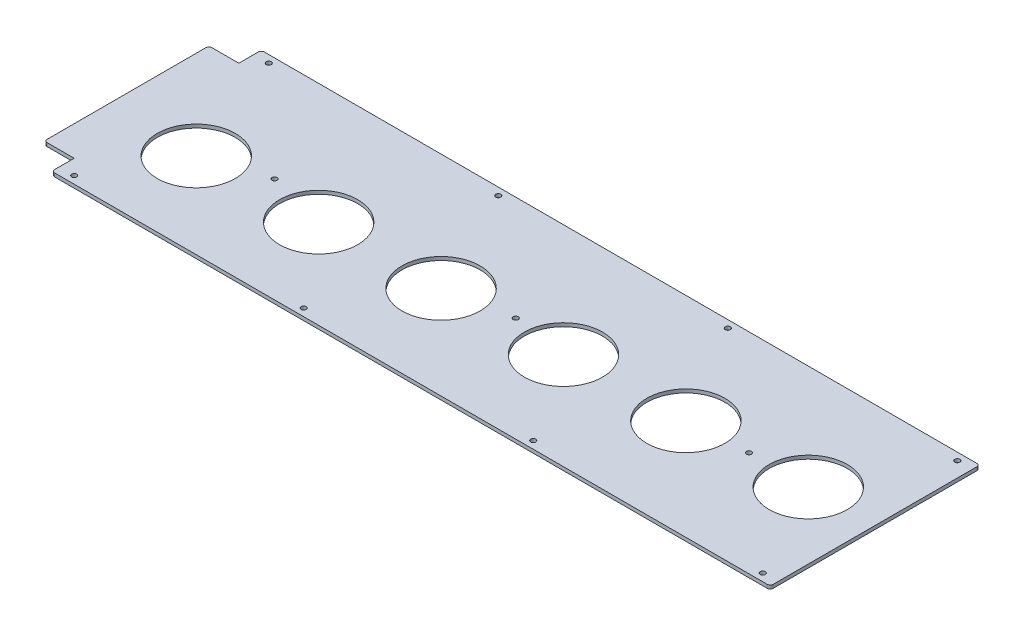
ISO-10303-21;
HEADER;
FILE_DESCRIPTION(('STEP AP214'),'2;1');
FILE_NAME('part.step','',(''),(''),'','','');
FILE_SCHEMA(('AUTOMOTIVE_DESIGN { 1 0 10303 214 1 1 1 1 }'));
ENDSEC;
DATA;
#1=APPLICATION_CONTEXT('core data for automotive mechanical design processes');
#2=APPLICATION_PROTOCOL_DEFINITION('international standard','automotive_design',2000,#1);
#3=PRODUCT_CONTEXT('',#1,'mechanical');
#4=PRODUCT('Part','Part','',(#3));
#5=PRODUCT_RELATED_PRODUCT_CATEGORY('part','',(#4));
#6=PRODUCT_DEFINITION_FORMATION('','',#4);
#7=PRODUCT_DEFINITION_CONTEXT('part definition',#1,'design');
#8=PRODUCT_DEFINITION('design','',#6,#7);
#9=PRODUCT_DEFINITION_SHAPE('','',#8);
#10=(LENGTH_UNIT() NAMED_UNIT(*) SI_UNIT(.MILLI.,.METRE.));
#11=(NAMED_UNIT(*) PLANE_ANGLE_UNIT() SI_UNIT($,.RADIAN.));
#12=(NAMED_UNIT(*) SI_UNIT($,.STERADIAN.) SOLID_ANGLE_UNIT());
#13=UNCERTAINTY_MEASURE_WITH_UNIT(LENGTH_MEASURE(1.E-05),#10,'distance_accuracy_value','');
#14=(GEOMETRIC_REPRESENTATION_CONTEXT(3) GLOBAL_UNCERTAINTY_ASSIGNED_CONTEXT((#13)) GLOBAL_UNIT_ASSIGNED_CONTEXT((#10,
#11,#12)) REPRESENTATION_CONTEXT('',''));
#15=CARTESIAN_POINT('',(0.,0.,0.));
#16=DIRECTION('',(0.,0.,1.));
#17=DIRECTION('',(1.,0.,0.));
#18=AXIS2_PLACEMENT_3D('',#15,#16,#17);
#19=CARTESIAN_POINT('',(0.,0.,0.));
#20=DIRECTION('',(0.,-1.,0.));
#21=DIRECTION('',(0.,0.,-1.));
#22=AXIS2_PLACEMENT_3D('',#19,#20,#21);
#23=PLANE('',#22);
#24=CARTESIAN_POINT('',(759.03965254764,0.,-38.9421624989442));
#25=DIRECTION('',(0.,1.,0.));
#26=DIRECTION('',(0.,0.,1.));
#27=AXIS2_PLACEMENT_3D('',#24,#25,#26);
#28=CIRCLE('',#27,2.15264999999998);
#29=CARTESIAN_POINT('',(759.03965254764,0.,-36.7895124989442));
#30=VERTEX_POINT('',#29);
#31=EDGE_CURVE('E360',#30,#30,#28,.T.);
#32=ORIENTED_EDGE('',*,*,#31,.T.);
#33=EDGE_LOOP('',(#32));
#34=FACE_BOUND('',#33,.T.);
#35=CARTESIAN_POINT('',(759.03965254764,0.,126.157837501056));
#36=DIRECTION('',(0.,1.,0.));
#37=DIRECTION('',(0.,0.,1.));
#38=AXIS2_PLACEMENT_3D('',#35,#36,#37);
#39=CIRCLE('',#38,2.15264999999998);
#40=CARTESIAN_POINT('',(759.03965254764,0.,128.310487501056));
#41=VERTEX_POINT('',#40);
#42=EDGE_CURVE('E354',#41,#41,#39,.T.);
#43=ORIENTED_EDGE('',*,*,#42,.T.);
#44=EDGE_LOOP('',(#43));
#45=FACE_BOUND('',#44,.T.);
#46=CARTESIAN_POINT('',(796.427342218507,0.,59.9573230555082));
#47=DIRECTION('',(0.,1.,0.));
#48=DIRECTION('',(0.,0.,1.));
#49=AXIS2_PLACEMENT_3D('',#46,#47,#48);
#50=CIRCLE('',#49,33.147);
#51=CARTESIAN_POINT('',(796.427342218507,0.,93.1043230555082));
#52=VERTEX_POINT('',#51);
#53=EDGE_CURVE('E295',#52,#52,#50,.T.);
#54=ORIENTED_EDGE('',*,*,#53,.T.);
#55=EDGE_LOOP('',(#54));
#56=FACE_BOUND('',#55,.T.);
#57=CARTESIAN_POINT('',(997.590666350161,0.,53.4175288337272));
#58=DIRECTION('',(0.,1.,0.));
#59=DIRECTION('',(0.,0.,1.));
#60=AXIS2_PLACEMENT_3D('',#57,#58,#59);
#61=CIRCLE('',#60,33.1470000000001);
#62=CARTESIAN_POINT('',(997.590666350161,0.,86.5645288337274));
#63=VERTEX_POINT('',#62);
#64=EDGE_CURVE('E283',#63,#63,#61,.T.);
#65=ORIENTED_EDGE('',*,*,#64,.T.);
#66=EDGE_LOOP('',(#65));
#67=FACE_BOUND('',#66,.T.);
#68=CARTESIAN_POINT('',(1299.33565254764,0.,43.6078375010559));
#69=DIRECTION('',(0.,1.,0.));
#70=DIRECTION('',(0.,0.,1.));
#71=AXIS2_PLACEMENT_3D('',#68,#69,#70);
#72=CIRCLE('',#71,33.1470000000001);
#73=CARTESIAN_POINT('',(1299.33565254764,0.,76.754837501056));
#74=VERTEX_POINT('',#73);
#75=EDGE_CURVE('E271',#74,#74,#72,.T.);
#76=ORIENTED_EDGE('',*,*,#75,.T.);
#77=EDGE_LOOP('',(#76));
#78=FACE_BOUND('',#77,.T.);
#79=DIRECTION('',(1.,0.,0.));
#80=VECTOR('',#79,1.);
#81=CARTESIAN_POINT('',(720.93965254764,0.,113.457837501056));
#82=LINE('',#81,#80);
#83=CARTESIAN_POINT('',(723.47965254764,0.,113.457837501056));
#84=VERTEX_POINT('',#83);
#85=CARTESIAN_POINT('',(746.33965254764,0.,113.457837501056));
#86=VERTEX_POINT('',#85);
#87=EDGE_CURVE('E189',#84,#86,#82,.T.);
#88=ORIENTED_EDGE('',*,*,#87,.F.);
#89=CARTESIAN_POINT('',(723.47965254764,0.,110.917837501056));
#90=DIRECTION('',(0.,-1.,0.));
#91=DIRECTION('',(0.,0.,-1.));
#92=AXIS2_PLACEMENT_3D('',#89,#90,#91);
#93=CIRCLE('',#92,2.54);
#94=CARTESIAN_POINT('',(720.93965254764,0.,110.917837501056));
#95=VERTEX_POINT('',#94);
#96=EDGE_CURVE('E208',#84,#95,#93,.T.);
#97=ORIENTED_EDGE('',*,*,#96,.T.);
#98=DIRECTION('',(0.,0.,1.));
#99=VECTOR('',#98,1.);
#100=CARTESIAN_POINT('',(720.93965254764,0.,-26.2421624989442));
#101=LINE('',#100,#99);
#102=CARTESIAN_POINT('',(720.93965254764,0.,-23.7021624989442));
#103=VERTEX_POINT('',#102);
#104=EDGE_CURVE('E186',#103,#95,#101,.T.);
#105=ORIENTED_EDGE('',*,*,#104,.F.);
#106=CARTESIAN_POINT('',(723.47965254764,0.,-23.7021624989442));
#107=DIRECTION('',(0.,-1.,0.));
#108=DIRECTION('',(0.,0.,-1.));
#109=AXIS2_PLACEMENT_3D('',#106,#107,#108);
#110=CIRCLE('',#109,2.54);
#111=CARTESIAN_POINT('',(723.47965254764,0.,-26.2421624989442));
#112=VERTEX_POINT('',#111);
#113=EDGE_CURVE('E206',#103,#112,#110,.T.);
#114=ORIENTED_EDGE('',*,*,#113,.T.);
#115=DIRECTION('',(-1.,0.,0.));
#116=VECTOR('',#115,1.);
#117=CARTESIAN_POINT('',(720.93965254764,0.,-26.2421624989442));
#118=LINE('',#117,#116);
#119=CARTESIAN_POINT('',(746.33965254764,0.,-26.2421624989442));
#120=VERTEX_POINT('',#119);
#121=EDGE_CURVE('E184',#120,#112,#118,.T.);
#122=ORIENTED_EDGE('',*,*,#121,.F.);
#123=DIRECTION('',(0.,0.,1.));
#124=VECTOR('',#123,1.);
#125=CARTESIAN_POINT('',(746.33965254764,0.,-45.2921624989443));
#126=LINE('',#125,#124);
#127=CARTESIAN_POINT('',(746.33965254764,0.,-42.7521624989443));
#128=VERTEX_POINT('',#127);
#129=EDGE_CURVE('E158',#128,#120,#126,.T.);
#130=ORIENTED_EDGE('',*,*,#129,.F.);
#131=CARTESIAN_POINT('',(748.87965254764,0.,-42.7521624989443));
#132=DIRECTION('',(0.,-1.,0.));
#133=DIRECTION('',(0.,0.,-1.));
#134=AXIS2_PLACEMENT_3D('',#131,#132,#133);
#135=CIRCLE('',#134,2.54);
#136=CARTESIAN_POINT('',(748.87965254764,0.,-45.2921624989443));
#137=VERTEX_POINT('',#136);
#138=EDGE_CURVE('E204',#128,#137,#135,.T.);
#139=ORIENTED_EDGE('',*,*,#138,.T.);
#140=DIRECTION('',(-1.,0.,0.));
#141=VECTOR('',#140,1.);
#142=CARTESIAN_POINT('',(1355.93965254764,0.,-45.2921624989444));
#143=LINE('',#142,#141);
#144=CARTESIAN_POINT('',(1353.39965254764,0.,-45.2921624989444));
#145=VERTEX_POINT('',#144);
#146=EDGE_CURVE('E180',#145,#137,#143,.T.);
#147=ORIENTED_EDGE('',*,*,#146,.F.);
#148=CARTESIAN_POINT('',(1353.39965254764,0.,-42.7521624989444));
#149=DIRECTION('',(0.,-1.,0.));
#150=DIRECTION('',(0.,0.,-1.));
#151=AXIS2_PLACEMENT_3D('',#148,#149,#150);
#152=CIRCLE('',#151,2.54);
#153=CARTESIAN_POINT('',(1355.93965254764,0.,-42.7521624989444));
#154=VERTEX_POINT('',#153);
#155=EDGE_CURVE('E198',#145,#154,#152,.T.);
#156=ORIENTED_EDGE('',*,*,#155,.T.);
#157=DIRECTION('',(0.,0.,-1.));
#158=VECTOR('',#157,1.);
#159=CARTESIAN_POINT('',(1355.93965254764,0.,-45.2921624989444));
#160=LINE('',#159,#158);
#161=CARTESIAN_POINT('',(1355.93965254764,0.,129.967837501056));
#162=VERTEX_POINT('',#161);
#163=EDGE_CURVE('E176',#162,#154,#160,.T.);
#164=ORIENTED_EDGE('',*,*,#163,.F.);
#165=CARTESIAN_POINT('',(1353.39965254764,0.,129.967837501056));
#166=DIRECTION('',(0.,-1.,0.));
#167=DIRECTION('',(0.,0.,-1.));
#168=AXIS2_PLACEMENT_3D('',#165,#166,#167);
#169=CIRCLE('',#168,2.54);
#170=CARTESIAN_POINT('',(1353.39965254764,0.,132.507837501056));
#171=VERTEX_POINT('',#170);
#172=EDGE_CURVE('E200',#162,#171,#169,.T.);
#173=ORIENTED_EDGE('',*,*,#172,.T.);
#174=DIRECTION('',(1.,0.,0.));
#175=VECTOR('',#174,1.);
#176=CARTESIAN_POINT('',(1355.93965254764,0.,132.507837501056));
#177=LINE('',#176,#175);
#178=CARTESIAN_POINT('',(748.87965254764,0.,132.507837501056));
#179=VERTEX_POINT('',#178);
#180=EDGE_CURVE('E173',#179,#171,#177,.T.);
#181=ORIENTED_EDGE('',*,*,#180,.F.);
#182=CARTESIAN_POINT('',(748.87965254764,0.,129.967837501056));
#183=DIRECTION('',(0.,-1.,0.));
#184=DIRECTION('',(0.,0.,-1.));
#185=AXIS2_PLACEMENT_3D('',#182,#183,#184);
#186=CIRCLE('',#185,2.54);
#187=CARTESIAN_POINT('',(746.33965254764,0.,129.967837501056));
#188=VERTEX_POINT('',#187);
#189=EDGE_CURVE('E202',#179,#188,#186,.T.);
#190=ORIENTED_EDGE('',*,*,#189,.T.);
#191=DIRECTION('',(0.,0.,1.));
#192=VECTOR('',#191,1.);
#193=CARTESIAN_POINT('',(746.33965254764,0.,132.507837501056));
#194=LINE('',#193,#192);
#195=EDGE_CURVE('E191',#86,#188,#194,.T.);
#196=ORIENTED_EDGE('',*,*,#195,.F.);
#197=EDGE_LOOP('',(#88,#97,#105,#114,#122,#130,#139,#147,#156,#164,#173,#181,#190,#196));
#198=FACE_BOUND('',#197,.T.);
#199=CARTESIAN_POINT('',(1198.75399048181,0.,46.8777346119463));
#200=DIRECTION('',(0.,1.,0.));
#201=DIRECTION('',(0.,0.,1.));
#202=AXIS2_PLACEMENT_3D('',#199,#200,#201);
#203=CIRCLE('',#202,33.1470000000001);
#204=CARTESIAN_POINT('',(1198.75399048181,0.,80.0247346119464));
#205=VERTEX_POINT('',#204);
#206=EDGE_CURVE('E265',#205,#205,#203,.T.);
#207=ORIENTED_EDGE('',*,*,#206,.T.);
#208=EDGE_LOOP('',(#207));
#209=FACE_BOUND('',#208,.T.);
#210=CARTESIAN_POINT('',(1098.17232841599,0.,50.1476317228368));
#211=DIRECTION('',(0.,1.,0.));
#212=DIRECTION('',(0.,0.,1.));
#213=AXIS2_PLACEMENT_3D('',#210,#211,#212);
#214=CIRCLE('',#213,33.1470000000001);
#215=CARTESIAN_POINT('',(1098.17232841599,0.,83.2946317228369));
#216=VERTEX_POINT('',#215);
#217=EDGE_CURVE('E277',#216,#216,#214,.T.);
#218=ORIENTED_EDGE('',*,*,#217,.T.);
#219=EDGE_LOOP('',(#218));
#220=FACE_BOUND('',#219,.T.);
#221=CARTESIAN_POINT('',(897.009004284334,0.,56.6874259446177));
#222=DIRECTION('',(0.,1.,0.));
#223=DIRECTION('',(0.,0.,1.));
#224=AXIS2_PLACEMENT_3D('',#221,#222,#223);
#225=CIRCLE('',#224,33.147);
#226=CARTESIAN_POINT('',(897.009004284334,0.,89.8344259446177));
#227=VERTEX_POINT('',#226);
#228=EDGE_CURVE('E289',#227,#227,#225,.T.);
#229=ORIENTED_EDGE('',*,*,#228,.T.);
#230=EDGE_LOOP('',(#229));
#231=FACE_BOUND('',#230,.T.);
#232=CARTESIAN_POINT('',(846.479052547642,0.,43.607837501056));
#233=DIRECTION('',(0.,1.,0.));
#234=DIRECTION('',(0.,0.,1.));
#235=AXIS2_PLACEMENT_3D('',#232,#233,#234);
#236=CIRCLE('',#235,2.15264999999998);
#237=CARTESIAN_POINT('',(846.479052547642,0.,45.7604875010559));
#238=VERTEX_POINT('',#237);
#239=EDGE_CURVE('E298',#238,#238,#236,.T.);
#240=ORIENTED_EDGE('',*,*,#239,.T.);
#241=EDGE_LOOP('',(#240));
#242=FACE_BOUND('',#241,.T.);
#243=CARTESIAN_POINT('',(1051.13965254764,0.,43.6078375010556));
#244=DIRECTION('',(0.,1.,0.));
#245=DIRECTION('',(0.,0.,1.));
#246=AXIS2_PLACEMENT_3D('',#243,#244,#245);
#247=CIRCLE('',#246,2.15264999999998);
#248=CARTESIAN_POINT('',(1051.13965254764,0.,45.7604875010556));
#249=VERTEX_POINT('',#248);
#250=EDGE_CURVE('E306',#249,#249,#247,.T.);
#251=ORIENTED_EDGE('',*,*,#250,.T.);
#252=EDGE_LOOP('',(#251));
#253=FACE_BOUND('',#252,.T.);
#254=CARTESIAN_POINT('',(1249.01825254764,0.,43.6078375010559));
#255=DIRECTION('',(0.,1.,0.));
#256=DIRECTION('',(0.,0.,1.));
#257=AXIS2_PLACEMENT_3D('',#254,#255,#256);
#258=CIRCLE('',#257,2.15264999999998);
#259=CARTESIAN_POINT('',(1249.01825254764,0.,45.7604875010559));
#260=VERTEX_POINT('',#259);
#261=EDGE_CURVE('E312',#260,#260,#258,.T.);
#262=ORIENTED_EDGE('',*,*,#261,.T.);
#263=EDGE_LOOP('',(#262));
#264=FACE_BOUND('',#263,.T.);
#265=CARTESIAN_POINT('',(1343.23965254764,0.,-38.9421624989444));
#266=DIRECTION('',(0.,1.,0.));
#267=DIRECTION('',(0.,0.,1.));
#268=AXIS2_PLACEMENT_3D('',#265,#266,#267);
#269=CIRCLE('',#268,2.15264999999998);
#270=CARTESIAN_POINT('',(1343.23965254764,0.,-36.7895124989445));
#271=VERTEX_POINT('',#270);
#272=EDGE_CURVE('E318',#271,#271,#269,.T.);
#273=ORIENTED_EDGE('',*,*,#272,.T.);
#274=EDGE_LOOP('',(#273));
#275=FACE_BOUND('',#274,.T.);
#276=CARTESIAN_POINT('',(1343.23965254764,0.,126.157837501056));
#277=DIRECTION('',(0.,1.,0.));
#278=DIRECTION('',(0.,0.,1.));
#279=AXIS2_PLACEMENT_3D('',#276,#277,#278);
#280=CIRCLE('',#279,2.15264999999998);
#281=CARTESIAN_POINT('',(1343.23965254764,0.,128.310487501056));
#282=VERTEX_POINT('',#281);
#283=EDGE_CURVE('E324',#282,#282,#280,.T.);
#284=ORIENTED_EDGE('',*,*,#283,.T.);
#285=EDGE_LOOP('',(#284));
#286=FACE_BOUND('',#285,.T.);
#287=CARTESIAN_POINT('',(1148.50631921431,0.,126.157837501056));
#288=DIRECTION('',(0.,1.,0.));
#289=DIRECTION('',(0.,0.,1.));
#290=AXIS2_PLACEMENT_3D('',#287,#288,#289);
#291=CIRCLE('',#290,2.15264999999998);
#292=CARTESIAN_POINT('',(1148.50631921431,0.,128.310487501056));
#293=VERTEX_POINT('',#292);
#294=EDGE_CURVE('E330',#293,#293,#291,.T.);
#295=ORIENTED_EDGE('',*,*,#294,.T.);
#296=EDGE_LOOP('',(#295));
#297=FACE_BOUND('',#296,.T.);
#298=CARTESIAN_POINT('',(1148.50631921431,0.,-38.9421624989442));
#299=DIRECTION('',(0.,1.,0.));
#300=DIRECTION('',(0.,0.,1.));
#301=AXIS2_PLACEMENT_3D('',#298,#299,#300);
#302=CIRCLE('',#301,2.15264999999998);
#303=CARTESIAN_POINT('',(1148.50631921431,0.,-36.7895124989442));
#304=VERTEX_POINT('',#303);
#305=EDGE_CURVE('E336',#304,#304,#302,.T.);
#306=ORIENTED_EDGE('',*,*,#305,.T.);
#307=EDGE_LOOP('',(#306));
#308=FACE_BOUND('',#307,.T.);
#309=CARTESIAN_POINT('',(953.772985880973,0.,-38.9421624989442));
#310=DIRECTION('',(0.,1.,0.));
#311=DIRECTION('',(0.,0.,1.));
#312=AXIS2_PLACEMENT_3D('',#309,#310,#311);
#313=CIRCLE('',#312,2.15264999999998);
#314=CARTESIAN_POINT('',(953.772985880973,0.,-36.7895124989442));
#315=VERTEX_POINT('',#314);
#316=EDGE_CURVE('E342',#315,#315,#313,.T.);
#317=ORIENTED_EDGE('',*,*,#316,.T.);
#318=EDGE_LOOP('',(#317));
#319=FACE_BOUND('',#318,.T.);
#320=CARTESIAN_POINT('',(953.772985880973,0.,126.157837501056));
#321=DIRECTION('',(0.,1.,0.));
#322=DIRECTION('',(0.,0.,1.));
#323=AXIS2_PLACEMENT_3D('',#320,#321,#322);
#324=CIRCLE('',#323,2.15264999999998);
#325=CARTESIAN_POINT('',(953.772985880973,0.,128.310487501056));
#326=VERTEX_POINT('',#325);
#327=EDGE_CURVE('E348',#326,#326,#324,.T.);
#328=ORIENTED_EDGE('',*,*,#327,.T.);
#329=EDGE_LOOP('',(#328));
#330=FACE_BOUND('',#329,.T.);
#331=ADVANCED_FACE('F35',(#34,#45,#56,#67,#78,#198,#209,#220,#231,#242,#253,#264,#275,#286,#297,
#308,#319,#330),#23,.T.);
#332=CARTESIAN_POINT('',(0.,2.9718,0.));
#333=DIRECTION('',(0.,-1.,0.));
#334=DIRECTION('',(0.,0.,-1.));
#335=AXIS2_PLACEMENT_3D('',#332,#333,#334);
#336=PLANE('',#335);
#337=CARTESIAN_POINT('',(759.03965254764,2.9718,-38.9421624989442));
#338=DIRECTION('',(0.,1.,0.));
#339=DIRECTION('',(0.,0.,1.));
#340=AXIS2_PLACEMENT_3D('',#337,#338,#339);
#341=CIRCLE('',#340,2.15264999999998);
#342=CARTESIAN_POINT('',(759.03965254764,2.9718,-36.7895124989442));
#343=VERTEX_POINT('',#342);
#344=EDGE_CURVE('E363',#343,#343,#341,.T.);
#345=ORIENTED_EDGE('',*,*,#344,.F.);
#346=EDGE_LOOP('',(#345));
#347=FACE_BOUND('',#346,.T.);
#348=CARTESIAN_POINT('',(759.03965254764,2.9718,126.157837501056));
#349=DIRECTION('',(0.,1.,0.));
#350=DIRECTION('',(0.,0.,1.));
#351=AXIS2_PLACEMENT_3D('',#348,#349,#350);
#352=CIRCLE('',#351,2.15264999999998);
#353=CARTESIAN_POINT('',(759.03965254764,2.9718,128.310487501056));
#354=VERTEX_POINT('',#353);
#355=EDGE_CURVE('E357',#354,#354,#352,.T.);
#356=ORIENTED_EDGE('',*,*,#355,.F.);
#357=EDGE_LOOP('',(#356));
#358=FACE_BOUND('',#357,.T.);
#359=CARTESIAN_POINT('',(953.772985880973,2.9718,126.157837501056));
#360=DIRECTION('',(0.,1.,0.));
#361=DIRECTION('',(0.,0.,1.));
#362=AXIS2_PLACEMENT_3D('',#359,#360,#361);
#363=CIRCLE('',#362,2.15264999999998);
#364=CARTESIAN_POINT('',(953.772985880973,2.9718,128.310487501056));
#365=VERTEX_POINT('',#364);
#366=EDGE_CURVE('E351',#365,#365,#363,.T.);
#367=ORIENTED_EDGE('',*,*,#366,.F.);
#368=EDGE_LOOP('',(#367));
#369=FACE_BOUND('',#368,.T.);
#370=CARTESIAN_POINT('',(953.772985880973,2.9718,-38.9421624989442));
#371=DIRECTION('',(0.,1.,0.));
#372=DIRECTION('',(0.,0.,1.));
#373=AXIS2_PLACEMENT_3D('',#370,#371,#372);
#374=CIRCLE('',#373,2.15264999999998);
#375=CARTESIAN_POINT('',(953.772985880973,2.9718,-36.7895124989442));
#376=VERTEX_POINT('',#375);
#377=EDGE_CURVE('E345',#376,#376,#374,.T.);
#378=ORIENTED_EDGE('',*,*,#377,.F.);
#379=EDGE_LOOP('',(#378));
#380=FACE_BOUND('',#379,.T.);
#381=CARTESIAN_POINT('',(1148.50631921431,2.9718,-38.9421624989442));
#382=DIRECTION('',(0.,1.,0.));
#383=DIRECTION('',(0.,0.,1.));
#384=AXIS2_PLACEMENT_3D('',#381,#382,#383);
#385=CIRCLE('',#384,2.15264999999998);
#386=CARTESIAN_POINT('',(1148.50631921431,2.9718,-36.7895124989442));
#387=VERTEX_POINT('',#386);
#388=EDGE_CURVE('E339',#387,#387,#385,.T.);
#389=ORIENTED_EDGE('',*,*,#388,.F.);
#390=EDGE_LOOP('',(#389));
#391=FACE_BOUND('',#390,.T.);
#392=CARTESIAN_POINT('',(1148.50631921431,2.9718,126.157837501056));
#393=DIRECTION('',(0.,1.,0.));
#394=DIRECTION('',(0.,0.,1.));
#395=AXIS2_PLACEMENT_3D('',#392,#393,#394);
#396=CIRCLE('',#395,2.15264999999998);
#397=CARTESIAN_POINT('',(1148.50631921431,2.9718,128.310487501056));
#398=VERTEX_POINT('',#397);
#399=EDGE_CURVE('E333',#398,#398,#396,.T.);
#400=ORIENTED_EDGE('',*,*,#399,.F.);
#401=EDGE_LOOP('',(#400));
#402=FACE_BOUND('',#401,.T.);
#403=CARTESIAN_POINT('',(1343.23965254764,2.9718,126.157837501056));
#404=DIRECTION('',(0.,1.,0.));
#405=DIRECTION('',(0.,0.,1.));
#406=AXIS2_PLACEMENT_3D('',#403,#404,#405);
#407=CIRCLE('',#406,2.15264999999998);
#408=CARTESIAN_POINT('',(1343.23965254764,2.9718,128.310487501056));
#409=VERTEX_POINT('',#408);
#410=EDGE_CURVE('E327',#409,#409,#407,.T.);
#411=ORIENTED_EDGE('',*,*,#410,.F.);
#412=EDGE_LOOP('',(#411));
#413=FACE_BOUND('',#412,.T.);
#414=CARTESIAN_POINT('',(1343.23965254764,2.9718,-38.9421624989444));
#415=DIRECTION('',(0.,1.,0.));
#416=DIRECTION('',(0.,0.,1.));
#417=AXIS2_PLACEMENT_3D('',#414,#415,#416);
#418=CIRCLE('',#417,2.15264999999998);
#419=CARTESIAN_POINT('',(1343.23965254764,2.9718,-36.7895124989445));
#420=VERTEX_POINT('',#419);
#421=EDGE_CURVE('E321',#420,#420,#418,.T.);
#422=ORIENTED_EDGE('',*,*,#421,.F.);
#423=EDGE_LOOP('',(#422));
#424=FACE_BOUND('',#423,.T.);
#425=CARTESIAN_POINT('',(1249.01825254764,2.9718,43.6078375010559));
#426=DIRECTION('',(0.,1.,0.));
#427=DIRECTION('',(0.,0.,1.));
#428=AXIS2_PLACEMENT_3D('',#425,#426,#427);
#429=CIRCLE('',#428,2.15264999999998);
#430=CARTESIAN_POINT('',(1249.01825254764,2.9718,45.7604875010559));
#431=VERTEX_POINT('',#430);
#432=EDGE_CURVE('E315',#431,#431,#429,.T.);
#433=ORIENTED_EDGE('',*,*,#432,.F.);
#434=EDGE_LOOP('',(#433));
#435=FACE_BOUND('',#434,.T.);
#436=CARTESIAN_POINT('',(1051.13965254764,2.9718,43.6078375010556));
#437=DIRECTION('',(0.,1.,0.));
#438=DIRECTION('',(0.,0.,1.));
#439=AXIS2_PLACEMENT_3D('',#436,#437,#438);
#440=CIRCLE('',#439,2.15264999999998);
#441=CARTESIAN_POINT('',(1051.13965254764,2.9718,45.7604875010556));
#442=VERTEX_POINT('',#441);
#443=EDGE_CURVE('E309',#442,#442,#440,.T.);
#444=ORIENTED_EDGE('',*,*,#443,.F.);
#445=EDGE_LOOP('',(#444));
#446=FACE_BOUND('',#445,.T.);
#447=DIRECTION('',(0.,0.,1.));
#448=VECTOR('',#447,1.);
#449=CARTESIAN_POINT('',(720.93965254764,2.9718,-26.2421624989442));
#450=LINE('',#449,#448);
#451=CARTESIAN_POINT('',(720.93965254764,2.9718,-23.7021624989442));
#452=VERTEX_POINT('',#451);
#453=CARTESIAN_POINT('',(720.93965254764,2.9718,110.917837501056));
#454=VERTEX_POINT('',#453);
#455=EDGE_CURVE('E164',#452,#454,#450,.T.);
#456=ORIENTED_EDGE('',*,*,#455,.T.);
#457=CARTESIAN_POINT('',(723.47965254764,2.9718,110.917837501056));
#458=DIRECTION('',(0.,-1.,0.));
#459=DIRECTION('',(0.,0.,-1.));
#460=AXIS2_PLACEMENT_3D('',#457,#458,#459);
#461=CIRCLE('',#460,2.54);
#462=CARTESIAN_POINT('',(723.47965254764,2.9718,113.457837501056));
#463=VERTEX_POINT('',#462);
#464=EDGE_CURVE('E224',#454,#463,#461,.F.);
#465=ORIENTED_EDGE('',*,*,#464,.T.);
#466=DIRECTION('',(1.,0.,0.));
#467=VECTOR('',#466,1.);
#468=CARTESIAN_POINT('',(720.93965254764,2.9718,113.457837501056));
#469=LINE('',#468,#467);
#470=CARTESIAN_POINT('',(746.33965254764,2.9718,113.457837501056));
#471=VERTEX_POINT('',#470);
#472=EDGE_CURVE('E166',#463,#471,#469,.T.);
#473=ORIENTED_EDGE('',*,*,#472,.T.);
#474=DIRECTION('',(0.,0.,1.));
#475=VECTOR('',#474,1.);
#476=CARTESIAN_POINT('',(746.33965254764,2.9718,132.507837501056));
#477=LINE('',#476,#475);
#478=CARTESIAN_POINT('',(746.33965254764,2.9718,129.967837501056));
#479=VERTEX_POINT('',#478);
#480=EDGE_CURVE('E171',#471,#479,#477,.T.);
#481=ORIENTED_EDGE('',*,*,#480,.T.);
#482=CARTESIAN_POINT('',(748.87965254764,2.9718,129.967837501056));
#483=DIRECTION('',(0.,-1.,0.));
#484=DIRECTION('',(0.,0.,-1.));
#485=AXIS2_PLACEMENT_3D('',#482,#483,#484);
#486=CIRCLE('',#485,2.54);
#487=CARTESIAN_POINT('',(748.87965254764,2.9718,132.507837501056));
#488=VERTEX_POINT('',#487);
#489=EDGE_CURVE('E219',#479,#488,#486,.F.);
#490=ORIENTED_EDGE('',*,*,#489,.T.);
#491=DIRECTION('',(1.,0.,0.));
#492=VECTOR('',#491,1.);
#493=CARTESIAN_POINT('',(1355.93965254764,2.9718,132.507837501056));
#494=LINE('',#493,#492);
#495=CARTESIAN_POINT('',(1353.39965254764,2.9718,132.507837501056));
#496=VERTEX_POINT('',#495);
#497=EDGE_CURVE('E193',#488,#496,#494,.T.);
#498=ORIENTED_EDGE('',*,*,#497,.T.);
#499=CARTESIAN_POINT('',(1353.39965254764,2.9718,129.967837501056));
#500=DIRECTION('',(0.,-1.,0.));
#501=DIRECTION('',(0.,0.,-1.));
#502=AXIS2_PLACEMENT_3D('',#499,#500,#501);
#503=CIRCLE('',#502,2.54);
#504=CARTESIAN_POINT('',(1355.93965254764,2.9718,129.967837501056));
#505=VERTEX_POINT('',#504);
#506=EDGE_CURVE('E217',#496,#505,#503,.F.);
#507=ORIENTED_EDGE('',*,*,#506,.T.);
#508=DIRECTION('',(0.,0.,-1.));
#509=VECTOR('',#508,1.);
#510=CARTESIAN_POINT('',(1355.93965254764,2.9718,-45.2921624989444));
#511=LINE('',#510,#509);
#512=CARTESIAN_POINT('',(1355.93965254764,2.9718,-42.7521624989444));
#513=VERTEX_POINT('',#512);
#514=EDGE_CURVE('E244',#505,#513,#511,.T.);
#515=ORIENTED_EDGE('',*,*,#514,.T.);
#516=CARTESIAN_POINT('',(1353.39965254764,2.9718,-42.7521624989444));
#517=DIRECTION('',(0.,-1.,0.));
#518=DIRECTION('',(0.,0.,-1.));
#519=AXIS2_PLACEMENT_3D('',#516,#517,#518);
#520=CIRCLE('',#519,2.54);
#521=CARTESIAN_POINT('',(1353.39965254764,2.9718,-45.2921624989444));
#522=VERTEX_POINT('',#521);
#523=EDGE_CURVE('E215',#513,#522,#520,.F.);
#524=ORIENTED_EDGE('',*,*,#523,.T.);
#525=DIRECTION('',(-1.,0.,0.));
#526=VECTOR('',#525,1.);
#527=CARTESIAN_POINT('',(1355.93965254764,2.9718,-45.2921624989444));
#528=LINE('',#527,#526);
#529=CARTESIAN_POINT('',(748.87965254764,2.9718,-45.2921624989443));
#530=VERTEX_POINT('',#529);
#531=EDGE_CURVE('E152',#522,#530,#528,.T.);
#532=ORIENTED_EDGE('',*,*,#531,.T.);
#533=CARTESIAN_POINT('',(748.87965254764,2.9718,-42.7521624989443));
#534=DIRECTION('',(0.,-1.,0.));
#535=DIRECTION('',(0.,0.,-1.));
#536=AXIS2_PLACEMENT_3D('',#533,#534,#535);
#537=CIRCLE('',#536,2.54);
#538=CARTESIAN_POINT('',(746.33965254764,2.9718,-42.7521624989443));
#539=VERTEX_POINT('',#538);
#540=EDGE_CURVE('E148',#530,#539,#537,.F.);
#541=ORIENTED_EDGE('',*,*,#540,.T.);
#542=DIRECTION('',(0.,0.,1.));
#543=VECTOR('',#542,1.);
#544=CARTESIAN_POINT('',(746.33965254764,2.9718,-45.2921624989443));
#545=LINE('',#544,#543);
#546=CARTESIAN_POINT('',(746.33965254764,2.9718,-26.2421624989442));
#547=VERTEX_POINT('',#546);
#548=EDGE_CURVE('E139',#539,#547,#545,.T.);
#549=ORIENTED_EDGE('',*,*,#548,.T.);
#550=DIRECTION('',(-1.,0.,0.));
#551=VECTOR('',#550,1.);
#552=CARTESIAN_POINT('',(720.93965254764,2.9718,-26.2421624989442));
#553=LINE('',#552,#551);
#554=CARTESIAN_POINT('',(723.47965254764,2.9718,-26.2421624989442));
#555=VERTEX_POINT('',#554);
#556=EDGE_CURVE('E144',#547,#555,#553,.T.);
#557=ORIENTED_EDGE('',*,*,#556,.T.);
#558=CARTESIAN_POINT('',(723.47965254764,2.9718,-23.7021624989442));
#559=DIRECTION('',(0.,-1.,0.));
#560=DIRECTION('',(0.,0.,-1.));
#561=AXIS2_PLACEMENT_3D('',#558,#559,#560);
#562=CIRCLE('',#561,2.54);
#563=EDGE_CURVE('E222',#555,#452,#562,.F.);
#564=ORIENTED_EDGE('',*,*,#563,.T.);
#565=EDGE_LOOP('',(#456,#465,#473,#481,#490,#498,#507,#515,#524,#532,#541,#549,#557,#564));
#566=FACE_BOUND('',#565,.T.);
#567=CARTESIAN_POINT('',(1198.75399048181,2.9718,46.8777346119463));
#568=DIRECTION('',(0.,1.,0.));
#569=DIRECTION('',(0.,0.,1.));
#570=AXIS2_PLACEMENT_3D('',#567,#568,#569);
#571=CIRCLE('',#570,33.1470000000001);
#572=CARTESIAN_POINT('',(1198.75399048181,2.9718,80.0247346119464));
#573=VERTEX_POINT('',#572);
#574=EDGE_CURVE('E177',#573,#573,#571,.T.);
#575=ORIENTED_EDGE('',*,*,#574,.F.);
#576=EDGE_LOOP('',(#575));
#577=FACE_BOUND('',#576,.T.);
#578=CARTESIAN_POINT('',(1299.33565254764,2.9718,43.6078375010559));
#579=DIRECTION('',(0.,1.,0.));
#580=DIRECTION('',(0.,0.,1.));
#581=AXIS2_PLACEMENT_3D('',#578,#579,#580);
#582=CIRCLE('',#581,33.1470000000001);
#583=CARTESIAN_POINT('',(1299.33565254764,2.9718,76.754837501056));
#584=VERTEX_POINT('',#583);
#585=EDGE_CURVE('E268',#584,#584,#582,.T.);
#586=ORIENTED_EDGE('',*,*,#585,.F.);
#587=EDGE_LOOP('',(#586));
#588=FACE_BOUND('',#587,.T.);
#589=CARTESIAN_POINT('',(1098.17232841599,2.9718,50.1476317228368));
#590=DIRECTION('',(0.,1.,0.));
#591=DIRECTION('',(0.,0.,1.));
#592=AXIS2_PLACEMENT_3D('',#589,#590,#591);
#593=CIRCLE('',#592,33.1470000000001);
#594=CARTESIAN_POINT('',(1098.17232841599,2.9718,83.2946317228369));
#595=VERTEX_POINT('',#594);
#596=EDGE_CURVE('E274',#595,#595,#593,.T.);
#597=ORIENTED_EDGE('',*,*,#596,.F.);
#598=EDGE_LOOP('',(#597));
#599=FACE_BOUND('',#598,.T.);
#600=CARTESIAN_POINT('',(997.590666350161,2.9718,53.4175288337272));
#601=DIRECTION('',(0.,1.,0.));
#602=DIRECTION('',(0.,0.,1.));
#603=AXIS2_PLACEMENT_3D('',#600,#601,#602);
#604=CIRCLE('',#603,33.1470000000001);
#605=CARTESIAN_POINT('',(997.590666350161,2.9718,86.5645288337274));
#606=VERTEX_POINT('',#605);
#607=EDGE_CURVE('E280',#606,#606,#604,.T.);
#608=ORIENTED_EDGE('',*,*,#607,.F.);
#609=EDGE_LOOP('',(#608));
#610=FACE_BOUND('',#609,.T.);
#611=CARTESIAN_POINT('',(897.009004284334,2.9718,56.6874259446177));
#612=DIRECTION('',(0.,1.,0.));
#613=DIRECTION('',(0.,0.,1.));
#614=AXIS2_PLACEMENT_3D('',#611,#612,#613);
#615=CIRCLE('',#614,33.147);
#616=CARTESIAN_POINT('',(897.009004284334,2.9718,89.8344259446177));
#617=VERTEX_POINT('',#616);
#618=EDGE_CURVE('E286',#617,#617,#615,.T.);
#619=ORIENTED_EDGE('',*,*,#618,.F.);
#620=EDGE_LOOP('',(#619));
#621=FACE_BOUND('',#620,.T.);
#622=CARTESIAN_POINT('',(796.427342218507,2.9718,59.9573230555082));
#623=DIRECTION('',(0.,1.,0.));
#624=DIRECTION('',(0.,0.,1.));
#625=AXIS2_PLACEMENT_3D('',#622,#623,#624);
#626=CIRCLE('',#625,33.147);
#627=CARTESIAN_POINT('',(796.427342218507,2.9718,93.1043230555082));
#628=VERTEX_POINT('',#627);
#629=EDGE_CURVE('E292',#628,#628,#626,.T.);
#630=ORIENTED_EDGE('',*,*,#629,.F.);
#631=EDGE_LOOP('',(#630));
#632=FACE_BOUND('',#631,.T.);
#633=CARTESIAN_POINT('',(846.479052547642,2.9718,43.607837501056));
#634=DIRECTION('',(0.,1.,0.));
#635=DIRECTION('',(0.,0.,1.));
#636=AXIS2_PLACEMENT_3D('',#633,#634,#635);
#637=CIRCLE('',#636,2.15264999999998);
#638=CARTESIAN_POINT('',(846.479052547642,2.9718,45.7604875010559));
#639=VERTEX_POINT('',#638);
#640=EDGE_CURVE('E303',#639,#639,#637,.T.);
#641=ORIENTED_EDGE('',*,*,#640,.F.);
#642=EDGE_LOOP('',(#641));
#643=FACE_BOUND('',#642,.T.);
#644=ADVANCED_FACE('F142',(#347,#358,#369,#380,#391,#402,#413,#424,#435,#446,#566,#577,#588,
#599,#610,#621,#632,#643),#336,.F.);
#645=CARTESIAN_POINT('',(1355.93965254764,2.9718,132.507837501056));
#646=DIRECTION('',(0.,0.,-1.));
#647=DIRECTION('',(-1.,0.,0.));
#648=AXIS2_PLACEMENT_3D('',#645,#646,#647);
#649=PLANE('',#648);
#650=ORIENTED_EDGE('',*,*,#497,.F.);
#651=DIRECTION('',(0.,-1.,0.));
#652=VECTOR('',#651,1.);
#653=CARTESIAN_POINT('',(748.87965254764,2.9718,132.507837501056));
#654=LINE('',#653,#652);
#655=EDGE_CURVE('E236',#488,#179,#654,.T.);
#656=ORIENTED_EDGE('',*,*,#655,.T.);
#657=ORIENTED_EDGE('',*,*,#180,.T.);
#658=DIRECTION('',(0.,-1.,0.));
#659=VECTOR('',#658,1.);
#660=CARTESIAN_POINT('',(1353.39965254764,2.9718,132.507837501056));
#661=LINE('',#660,#659);
#662=EDGE_CURVE('E234',#171,#496,#661,.F.);
#663=ORIENTED_EDGE('',*,*,#662,.T.);
#664=EDGE_LOOP('',(#650,#656,#657,#663));
#665=FACE_BOUND('',#664,.T.);
#666=ADVANCED_FACE('F371',(#665),#649,.F.);
#667=CARTESIAN_POINT('',(1355.93965254764,2.9718,-45.2921624989444));
#668=DIRECTION('',(-1.,0.,0.));
#669=DIRECTION('',(0.,0.,1.));
#670=AXIS2_PLACEMENT_3D('',#667,#668,#669);
#671=PLANE('',#670);
#672=ORIENTED_EDGE('',*,*,#514,.F.);
#673=DIRECTION('',(0.,-1.,0.));
#674=VECTOR('',#673,1.);
#675=CARTESIAN_POINT('',(1355.93965254764,2.9718,129.967837501056));
#676=LINE('',#675,#674);
#677=EDGE_CURVE('E11',#505,#162,#676,.T.);
#678=ORIENTED_EDGE('',*,*,#677,.T.);
#679=ORIENTED_EDGE('',*,*,#163,.T.);
#680=DIRECTION('',(0.,-1.,0.));
#681=VECTOR('',#680,1.);
#682=CARTESIAN_POINT('',(1355.93965254764,2.9718,-42.7521624989444));
#683=LINE('',#682,#681);
#684=EDGE_CURVE('E43',#154,#513,#683,.F.);
#685=ORIENTED_EDGE('',*,*,#684,.T.);
#686=EDGE_LOOP('',(#672,#678,#679,#685));
#687=FACE_BOUND('',#686,.T.);
#688=ADVANCED_FACE('F243',(#687),#671,.F.);
#689=CARTESIAN_POINT('',(1355.93965254764,2.9718,-45.2921624989444));
#690=DIRECTION('',(0.,0.,1.));
#691=DIRECTION('',(1.,0.,0.));
#692=AXIS2_PLACEMENT_3D('',#689,#690,#691);
#693=PLANE('',#692);
#694=ORIENTED_EDGE('',*,*,#146,.T.);
#695=DIRECTION('',(0.,-1.,0.));
#696=VECTOR('',#695,1.);
#697=CARTESIAN_POINT('',(748.87965254764,2.9718,-45.2921624989443));
#698=LINE('',#697,#696);
#699=EDGE_CURVE('E232',#137,#530,#698,.F.);
#700=ORIENTED_EDGE('',*,*,#699,.T.);
#701=ORIENTED_EDGE('',*,*,#531,.F.);
#702=DIRECTION('',(0.,-1.,0.));
#703=VECTOR('',#702,1.);
#704=CARTESIAN_POINT('',(1353.39965254764,2.9718,-45.2921624989444));
#705=LINE('',#704,#703);
#706=EDGE_CURVE('E229',#522,#145,#705,.T.);
#707=ORIENTED_EDGE('',*,*,#706,.T.);
#708=EDGE_LOOP('',(#694,#700,#701,#707));
#709=FACE_BOUND('',#708,.T.);
#710=ADVANCED_FACE('F256',(#709),#693,.F.);
#711=CARTESIAN_POINT('',(746.33965254764,2.9718,-45.2921624989443));
#712=DIRECTION('',(1.,0.,0.));
#713=DIRECTION('',(0.,0.,-1.));
#714=AXIS2_PLACEMENT_3D('',#711,#712,#713);
#715=PLANE('',#714);
#716=ORIENTED_EDGE('',*,*,#548,.F.);
#717=DIRECTION('',(0.,-1.,0.));
#718=VECTOR('',#717,1.);
#719=CARTESIAN_POINT('',(746.33965254764,2.9718,-42.7521624989443));
#720=LINE('',#719,#718);
#721=EDGE_CURVE('E227',#539,#128,#720,.T.);
#722=ORIENTED_EDGE('',*,*,#721,.T.);
#723=ORIENTED_EDGE('',*,*,#129,.T.);
#724=DIRECTION('',(0.,-1.,0.));
#725=VECTOR('',#724,1.);
#726=CARTESIAN_POINT('',(746.33965254764,2.9718,-26.2421624989442));
#727=LINE('',#726,#725);
#728=EDGE_CURVE('E155',#547,#120,#727,.T.);
#729=ORIENTED_EDGE('',*,*,#728,.F.);
#730=EDGE_LOOP('',(#716,#722,#723,#729));
#731=FACE_BOUND('',#730,.T.);
#732=ADVANCED_FACE('F156',(#731),#715,.F.);
#733=CARTESIAN_POINT('',(720.93965254764,2.9718,-26.2421624989442));
#734=DIRECTION('',(0.,0.,1.));
#735=DIRECTION('',(1.,0.,0.));
#736=AXIS2_PLACEMENT_3D('',#733,#734,#735);
#737=PLANE('',#736);
#738=ORIENTED_EDGE('',*,*,#121,.T.);
#739=DIRECTION('',(0.,-1.,0.));
#740=VECTOR('',#739,1.);
#741=CARTESIAN_POINT('',(723.47965254764,2.9718,-26.2421624989442));
#742=LINE('',#741,#740);
#743=EDGE_CURVE('E58',#112,#555,#742,.F.);
#744=ORIENTED_EDGE('',*,*,#743,.T.);
#745=ORIENTED_EDGE('',*,*,#556,.F.);
#746=ORIENTED_EDGE('',*,*,#728,.T.);
#747=EDGE_LOOP('',(#738,#744,#745,#746));
#748=FACE_BOUND('',#747,.T.);
#749=ADVANCED_FACE('F163',(#748),#737,.F.);
#750=CARTESIAN_POINT('',(720.93965254764,2.9718,-26.2421624989442));
#751=DIRECTION('',(1.,0.,0.));
#752=DIRECTION('',(0.,0.,-1.));
#753=AXIS2_PLACEMENT_3D('',#750,#751,#752);
#754=PLANE('',#753);
#755=ORIENTED_EDGE('',*,*,#104,.T.);
#756=DIRECTION('',(0.,-1.,0.));
#757=VECTOR('',#756,1.);
#758=CARTESIAN_POINT('',(720.93965254764,2.9718,110.917837501056));
#759=LINE('',#758,#757);
#760=EDGE_CURVE('E213',#95,#454,#759,.F.);
#761=ORIENTED_EDGE('',*,*,#760,.T.);
#762=ORIENTED_EDGE('',*,*,#455,.F.);
#763=DIRECTION('',(0.,-1.,0.));
#764=VECTOR('',#763,1.);
#765=CARTESIAN_POINT('',(720.93965254764,2.9718,-23.7021624989442));
#766=LINE('',#765,#764);
#767=EDGE_CURVE('E210',#452,#103,#766,.T.);
#768=ORIENTED_EDGE('',*,*,#767,.T.);
#769=EDGE_LOOP('',(#755,#761,#762,#768));
#770=FACE_BOUND('',#769,.T.);
#771=ADVANCED_FACE('F423',(#770),#754,.F.);
#772=CARTESIAN_POINT('',(720.93965254764,2.9718,113.457837501056));
#773=DIRECTION('',(0.,0.,-1.));
#774=DIRECTION('',(-1.,0.,0.));
#775=AXIS2_PLACEMENT_3D('',#772,#773,#774);
#776=PLANE('',#775);
#777=ORIENTED_EDGE('',*,*,#472,.F.);
#778=DIRECTION('',(0.,-1.,0.));
#779=VECTOR('',#778,1.);
#780=CARTESIAN_POINT('',(723.47965254764,2.9718,113.457837501056));
#781=LINE('',#780,#779);
#782=EDGE_CURVE('E160',#463,#84,#781,.T.);
#783=ORIENTED_EDGE('',*,*,#782,.T.);
#784=ORIENTED_EDGE('',*,*,#87,.T.);
#785=DIRECTION('',(0.,-1.,0.));
#786=VECTOR('',#785,1.);
#787=CARTESIAN_POINT('',(746.33965254764,2.9718,113.457837501056));
#788=LINE('',#787,#786);
#789=EDGE_CURVE('E161',#471,#86,#788,.T.);
#790=ORIENTED_EDGE('',*,*,#789,.F.);
#791=EDGE_LOOP('',(#777,#783,#784,#790));
#792=FACE_BOUND('',#791,.T.);
#793=ADVANCED_FACE('F420',(#792),#776,.F.);
#794=CARTESIAN_POINT('',(746.33965254764,2.9718,132.507837501056));
#795=DIRECTION('',(1.,0.,0.));
#796=DIRECTION('',(0.,0.,-1.));
#797=AXIS2_PLACEMENT_3D('',#794,#795,#796);
#798=PLANE('',#797);
#799=ORIENTED_EDGE('',*,*,#195,.T.);
#800=DIRECTION('',(0.,-1.,0.));
#801=VECTOR('',#800,1.);
#802=CARTESIAN_POINT('',(746.33965254764,2.9718,129.967837501056));
#803=LINE('',#802,#801);
#804=EDGE_CURVE('E50',#188,#479,#803,.F.);
#805=ORIENTED_EDGE('',*,*,#804,.T.);
#806=ORIENTED_EDGE('',*,*,#480,.F.);
#807=ORIENTED_EDGE('',*,*,#789,.T.);
#808=EDGE_LOOP('',(#799,#805,#806,#807));
#809=FACE_BOUND('',#808,.T.);
#810=ADVANCED_FACE('F416',(#809),#798,.F.);
#811=CARTESIAN_POINT('',(1198.75399048181,2.9718,46.8777346119463));
#812=DIRECTION('',(0.,-1.,0.));
#813=DIRECTION('',(0.,0.,-1.));
#814=AXIS2_PLACEMENT_3D('',#811,#812,#813);
#815=CYLINDRICAL_SURFACE('',#814,33.1470000000001);
#816=ORIENTED_EDGE('',*,*,#574,.T.);
#817=EDGE_LOOP('',(#816));
#818=FACE_BOUND('',#817,.T.);
#819=ORIENTED_EDGE('',*,*,#206,.F.);
#820=EDGE_LOOP('',(#819));
#821=FACE_BOUND('',#820,.T.);
#822=ADVANCED_FACE('F419',(#818,#821),#815,.F.);
#823=CARTESIAN_POINT('',(1299.33565254764,2.9718,43.6078375010559));
#824=DIRECTION('',(0.,-1.,0.));
#825=DIRECTION('',(0.,0.,-1.));
#826=AXIS2_PLACEMENT_3D('',#823,#824,#825);
#827=CYLINDRICAL_SURFACE('',#826,33.1470000000001);
#828=ORIENTED_EDGE('',*,*,#585,.T.);
#829=EDGE_LOOP('',(#828));
#830=FACE_BOUND('',#829,.T.);
#831=ORIENTED_EDGE('',*,*,#75,.F.);
#832=EDGE_LOOP('',(#831));
#833=FACE_BOUND('',#832,.T.);
#834=ADVANCED_FACE('F695',(#830,#833),#827,.F.);
#835=CARTESIAN_POINT('',(1098.17232841599,2.9718,50.1476317228368));
#836=DIRECTION('',(0.,-1.,0.));
#837=DIRECTION('',(0.,0.,-1.));
#838=AXIS2_PLACEMENT_3D('',#835,#836,#837);
#839=CYLINDRICAL_SURFACE('',#838,33.1470000000001);
#840=ORIENTED_EDGE('',*,*,#596,.T.);
#841=EDGE_LOOP('',(#840));
#842=FACE_BOUND('',#841,.T.);
#843=ORIENTED_EDGE('',*,*,#217,.F.);
#844=EDGE_LOOP('',(#843));
#845=FACE_BOUND('',#844,.T.);
#846=ADVANCED_FACE('F685',(#842,#845),#839,.F.);
#847=CARTESIAN_POINT('',(997.590666350161,2.9718,53.4175288337272));
#848=DIRECTION('',(0.,-1.,0.));
#849=DIRECTION('',(0.,0.,-1.));
#850=AXIS2_PLACEMENT_3D('',#847,#848,#849);
#851=CYLINDRICAL_SURFACE('',#850,33.1470000000001);
#852=ORIENTED_EDGE('',*,*,#607,.T.);
#853=EDGE_LOOP('',(#852));
#854=FACE_BOUND('',#853,.T.);
#855=ORIENTED_EDGE('',*,*,#64,.F.);
#856=EDGE_LOOP('',(#855));
#857=FACE_BOUND('',#856,.T.);
#858=ADVANCED_FACE('F675',(#854,#857),#851,.F.);
#859=CARTESIAN_POINT('',(897.009004284334,2.9718,56.6874259446177));
#860=DIRECTION('',(0.,-1.,0.));
#861=DIRECTION('',(0.,0.,-1.));
#862=AXIS2_PLACEMENT_3D('',#859,#860,#861);
#863=CYLINDRICAL_SURFACE('',#862,33.147);
#864=ORIENTED_EDGE('',*,*,#618,.T.);
#865=EDGE_LOOP('',(#864));
#866=FACE_BOUND('',#865,.T.);
#867=ORIENTED_EDGE('',*,*,#228,.F.);
#868=EDGE_LOOP('',(#867));
#869=FACE_BOUND('',#868,.T.);
#870=ADVANCED_FACE('F665',(#866,#869),#863,.F.);
#871=CARTESIAN_POINT('',(796.427342218507,2.9718,59.9573230555082));
#872=DIRECTION('',(0.,-1.,0.));
#873=DIRECTION('',(0.,0.,-1.));
#874=AXIS2_PLACEMENT_3D('',#871,#872,#873);
#875=CYLINDRICAL_SURFACE('',#874,33.147);
#876=ORIENTED_EDGE('',*,*,#629,.T.);
#877=EDGE_LOOP('',(#876));
#878=FACE_BOUND('',#877,.T.);
#879=ORIENTED_EDGE('',*,*,#53,.F.);
#880=EDGE_LOOP('',(#879));
#881=FACE_BOUND('',#880,.T.);
#882=ADVANCED_FACE('F404',(#878,#881),#875,.F.);
#883=CARTESIAN_POINT('',(846.479052547642,2.9718,43.607837501056));
#884=DIRECTION('',(0.,1.,0.));
#885=DIRECTION('',(0.,0.,1.));
#886=AXIS2_PLACEMENT_3D('',#883,#884,#885);
#887=CYLINDRICAL_SURFACE('',#886,2.15264999999998);
#888=ORIENTED_EDGE('',*,*,#239,.F.);
#889=EDGE_LOOP('',(#888));
#890=FACE_BOUND('',#889,.T.);
#891=ORIENTED_EDGE('',*,*,#640,.T.);
#892=EDGE_LOOP('',(#891));
#893=FACE_BOUND('',#892,.T.);
#894=ADVANCED_FACE('F394',(#890,#893),#887,.F.);
#895=CARTESIAN_POINT('',(1051.13965254764,2.9718,43.6078375010556));
#896=DIRECTION('',(0.,1.,0.));
#897=DIRECTION('',(0.,0.,1.));
#898=AXIS2_PLACEMENT_3D('',#895,#896,#897);
#899=CYLINDRICAL_SURFACE('',#898,2.15264999999998);
#900=ORIENTED_EDGE('',*,*,#250,.F.);
#901=EDGE_LOOP('',(#900));
#902=FACE_BOUND('',#901,.T.);
#903=ORIENTED_EDGE('',*,*,#443,.T.);
#904=EDGE_LOOP('',(#903));
#905=FACE_BOUND('',#904,.T.);
#906=ADVANCED_FACE('F391',(#902,#905),#899,.F.);
#907=CARTESIAN_POINT('',(1249.01825254764,2.9718,43.6078375010559));
#908=DIRECTION('',(0.,1.,0.));
#909=DIRECTION('',(0.,0.,1.));
#910=AXIS2_PLACEMENT_3D('',#907,#908,#909);
#911=CYLINDRICAL_SURFACE('',#910,2.15264999999998);
#912=ORIENTED_EDGE('',*,*,#261,.F.);
#913=EDGE_LOOP('',(#912));
#914=FACE_BOUND('',#913,.T.);
#915=ORIENTED_EDGE('',*,*,#432,.T.);
#916=EDGE_LOOP('',(#915));
#917=FACE_BOUND('',#916,.T.);
#918=ADVANCED_FACE('F393',(#914,#917),#911,.F.);
#919=CARTESIAN_POINT('',(1343.23965254764,2.9718,-38.9421624989444));
#920=DIRECTION('',(0.,1.,0.));
#921=DIRECTION('',(0.,0.,1.));
#922=AXIS2_PLACEMENT_3D('',#919,#920,#921);
#923=CYLINDRICAL_SURFACE('',#922,2.15264999999998);
#924=ORIENTED_EDGE('',*,*,#272,.F.);
#925=EDGE_LOOP('',(#924));
#926=FACE_BOUND('',#925,.T.);
#927=ORIENTED_EDGE('',*,*,#421,.T.);
#928=EDGE_LOOP('',(#927));
#929=FACE_BOUND('',#928,.T.);
#930=ADVANCED_FACE('F401',(#926,#929),#923,.F.);
#931=CARTESIAN_POINT('',(1343.23965254764,2.9718,126.157837501056));
#932=DIRECTION('',(0.,1.,0.));
#933=DIRECTION('',(0.,0.,1.));
#934=AXIS2_PLACEMENT_3D('',#931,#932,#933);
#935=CYLINDRICAL_SURFACE('',#934,2.15264999999998);
#936=ORIENTED_EDGE('',*,*,#283,.F.);
#937=EDGE_LOOP('',(#936));
#938=FACE_BOUND('',#937,.T.);
#939=ORIENTED_EDGE('',*,*,#410,.T.);
#940=EDGE_LOOP('',(#939));
#941=FACE_BOUND('',#940,.T.);
#942=ADVANCED_FACE('F623',(#938,#941),#935,.F.);
#943=CARTESIAN_POINT('',(1148.50631921431,2.9718,126.157837501056));
#944=DIRECTION('',(0.,1.,0.));
#945=DIRECTION('',(0.,0.,1.));
#946=AXIS2_PLACEMENT_3D('',#943,#944,#945);
#947=CYLINDRICAL_SURFACE('',#946,2.15264999999998);
#948=ORIENTED_EDGE('',*,*,#294,.F.);
#949=EDGE_LOOP('',(#948));
#950=FACE_BOUND('',#949,.T.);
#951=ORIENTED_EDGE('',*,*,#399,.T.);
#952=EDGE_LOOP('',(#951));
#953=FACE_BOUND('',#952,.T.);
#954=ADVANCED_FACE('F613',(#950,#953),#947,.F.);
#955=CARTESIAN_POINT('',(1148.50631921431,2.9718,-38.9421624989442));
#956=DIRECTION('',(0.,1.,0.));
#957=DIRECTION('',(0.,0.,1.));
#958=AXIS2_PLACEMENT_3D('',#955,#956,#957);
#959=CYLINDRICAL_SURFACE('',#958,2.15264999999998);
#960=ORIENTED_EDGE('',*,*,#305,.F.);
#961=EDGE_LOOP('',(#960));
#962=FACE_BOUND('',#961,.T.);
#963=ORIENTED_EDGE('',*,*,#388,.T.);
#964=EDGE_LOOP('',(#963));
#965=FACE_BOUND('',#964,.T.);
#966=ADVANCED_FACE('F603',(#962,#965),#959,.F.);
#967=CARTESIAN_POINT('',(953.772985880973,2.9718,-38.9421624989442));
#968=DIRECTION('',(0.,1.,0.));
#969=DIRECTION('',(0.,0.,1.));
#970=AXIS2_PLACEMENT_3D('',#967,#968,#969);
#971=CYLINDRICAL_SURFACE('',#970,2.15264999999998);
#972=ORIENTED_EDGE('',*,*,#316,.F.);
#973=EDGE_LOOP('',(#972));
#974=FACE_BOUND('',#973,.T.);
#975=ORIENTED_EDGE('',*,*,#377,.T.);
#976=EDGE_LOOP('',(#975));
#977=FACE_BOUND('',#976,.T.);
#978=ADVANCED_FACE('F593',(#974,#977),#971,.F.);
#979=CARTESIAN_POINT('',(953.772985880973,2.9718,126.157837501056));
#980=DIRECTION('',(0.,1.,0.));
#981=DIRECTION('',(0.,0.,1.));
#982=AXIS2_PLACEMENT_3D('',#979,#980,#981);
#983=CYLINDRICAL_SURFACE('',#982,2.15264999999998);
#984=ORIENTED_EDGE('',*,*,#327,.F.);
#985=EDGE_LOOP('',(#984));
#986=FACE_BOUND('',#985,.T.);
#987=ORIENTED_EDGE('',*,*,#366,.T.);
#988=EDGE_LOOP('',(#987));
#989=FACE_BOUND('',#988,.T.);
#990=ADVANCED_FACE('F583',(#986,#989),#983,.F.);
#991=CARTESIAN_POINT('',(759.03965254764,2.9718,126.157837501056));
#992=DIRECTION('',(0.,1.,0.));
#993=DIRECTION('',(0.,0.,1.));
#994=AXIS2_PLACEMENT_3D('',#991,#992,#993);
#995=CYLINDRICAL_SURFACE('',#994,2.15264999999998);
#996=ORIENTED_EDGE('',*,*,#42,.F.);
#997=EDGE_LOOP('',(#996));
#998=FACE_BOUND('',#997,.T.);
#999=ORIENTED_EDGE('',*,*,#355,.T.);
#1000=EDGE_LOOP('',(#999));
#1001=FACE_BOUND('',#1000,.T.);
#1002=ADVANCED_FACE('F573',(#998,#1001),#995,.F.);
#1003=CARTESIAN_POINT('',(759.03965254764,2.9718,-38.9421624989442));
#1004=DIRECTION('',(0.,1.,0.));
#1005=DIRECTION('',(0.,0.,1.));
#1006=AXIS2_PLACEMENT_3D('',#1003,#1004,#1005);
#1007=CYLINDRICAL_SURFACE('',#1006,2.15264999999998);
#1008=ORIENTED_EDGE('',*,*,#31,.F.);
#1009=EDGE_LOOP('',(#1008));
#1010=FACE_BOUND('',#1009,.T.);
#1011=ORIENTED_EDGE('',*,*,#344,.T.);
#1012=EDGE_LOOP('',(#1011));
#1013=FACE_BOUND('',#1012,.T.);
#1014=ADVANCED_FACE('F367',(#1010,#1013),#1007,.F.);
#1015=CARTESIAN_POINT('',(723.47965254764,2.9718,110.917837501056));
#1016=DIRECTION('',(0.,-1.,0.));
#1017=DIRECTION('',(0.,0.,-1.));
#1018=AXIS2_PLACEMENT_3D('',#1015,#1016,#1017);
#1019=CYLINDRICAL_SURFACE('',#1018,2.54);
#1020=ORIENTED_EDGE('',*,*,#464,.F.);
#1021=ORIENTED_EDGE('',*,*,#760,.F.);
#1022=ORIENTED_EDGE('',*,*,#96,.F.);
#1023=ORIENTED_EDGE('',*,*,#782,.F.);
#1024=EDGE_LOOP('',(#1020,#1021,#1022,#1023));
#1025=FACE_BOUND('',#1024,.T.);
#1026=ADVANCED_FACE('F439',(#1025),#1019,.T.);
#1027=CARTESIAN_POINT('',(723.47965254764,2.9718,-23.7021624989442));
#1028=DIRECTION('',(0.,-1.,0.));
#1029=DIRECTION('',(0.,0.,-1.));
#1030=AXIS2_PLACEMENT_3D('',#1027,#1028,#1029);
#1031=CYLINDRICAL_SURFACE('',#1030,2.54);
#1032=ORIENTED_EDGE('',*,*,#563,.F.);
#1033=ORIENTED_EDGE('',*,*,#743,.F.);
#1034=ORIENTED_EDGE('',*,*,#113,.F.);
#1035=ORIENTED_EDGE('',*,*,#767,.F.);
#1036=EDGE_LOOP('',(#1032,#1033,#1034,#1035));
#1037=FACE_BOUND('',#1036,.T.);
#1038=ADVANCED_FACE('F442',(#1037),#1031,.T.);
#1039=CARTESIAN_POINT('',(748.87965254764,2.9718,-42.7521624989443));
#1040=DIRECTION('',(0.,-1.,0.));
#1041=DIRECTION('',(0.,0.,-1.));
#1042=AXIS2_PLACEMENT_3D('',#1039,#1040,#1041);
#1043=CYLINDRICAL_SURFACE('',#1042,2.54);
#1044=ORIENTED_EDGE('',*,*,#540,.F.);
#1045=ORIENTED_EDGE('',*,*,#699,.F.);
#1046=ORIENTED_EDGE('',*,*,#138,.F.);
#1047=ORIENTED_EDGE('',*,*,#721,.F.);
#1048=EDGE_LOOP('',(#1044,#1045,#1046,#1047));
#1049=FACE_BOUND('',#1048,.T.);
#1050=ADVANCED_FACE('F262',(#1049),#1043,.T.);
#1051=CARTESIAN_POINT('',(748.87965254764,2.9718,129.967837501056));
#1052=DIRECTION('',(0.,-1.,0.));
#1053=DIRECTION('',(0.,0.,-1.));
#1054=AXIS2_PLACEMENT_3D('',#1051,#1052,#1053);
#1055=CYLINDRICAL_SURFACE('',#1054,2.54);
#1056=ORIENTED_EDGE('',*,*,#489,.F.);
#1057=ORIENTED_EDGE('',*,*,#804,.F.);
#1058=ORIENTED_EDGE('',*,*,#189,.F.);
#1059=ORIENTED_EDGE('',*,*,#655,.F.);
#1060=EDGE_LOOP('',(#1056,#1057,#1058,#1059));
#1061=FACE_BOUND('',#1060,.T.);
#1062=ADVANCED_FACE('F449',(#1061),#1055,.T.);
#1063=CARTESIAN_POINT('',(1353.39965254764,2.9718,129.967837501056));
#1064=DIRECTION('',(0.,-1.,0.));
#1065=DIRECTION('',(0.,0.,-1.));
#1066=AXIS2_PLACEMENT_3D('',#1063,#1064,#1065);
#1067=CYLINDRICAL_SURFACE('',#1066,2.54);
#1068=ORIENTED_EDGE('',*,*,#506,.F.);
#1069=ORIENTED_EDGE('',*,*,#662,.F.);
#1070=ORIENTED_EDGE('',*,*,#172,.F.);
#1071=ORIENTED_EDGE('',*,*,#677,.F.);
#1072=EDGE_LOOP('',(#1068,#1069,#1070,#1071));
#1073=FACE_BOUND('',#1072,.T.);
#1074=ADVANCED_FACE('F451',(#1073),#1067,.T.);
#1075=CARTESIAN_POINT('',(1353.39965254764,2.9718,-42.7521624989444));
#1076=DIRECTION('',(0.,-1.,0.));
#1077=DIRECTION('',(0.,0.,-1.));
#1078=AXIS2_PLACEMENT_3D('',#1075,#1076,#1077);
#1079=CYLINDRICAL_SURFACE('',#1078,2.54);
#1080=ORIENTED_EDGE('',*,*,#523,.F.);
#1081=ORIENTED_EDGE('',*,*,#684,.F.);
#1082=ORIENTED_EDGE('',*,*,#155,.F.);
#1083=ORIENTED_EDGE('',*,*,#706,.F.);
#1084=EDGE_LOOP('',(#1080,#1081,#1082,#1083));
#1085=FACE_BOUND('',#1084,.T.);
#1086=ADVANCED_FACE('F37',(#1085),#1079,.T.);
#1087=CLOSED_SHELL('',(#331,#644,#666,#688,#710,#732,#749,#771,#793,#810,#822,#834,#846,#858,
#870,#882,#894,#906,#918,#930,#942,#954,#966,#978,#990,#1002,#1014,#1026,#1038,#1050,#1062,
#1074,#1086));
#1088=MANIFOLD_SOLID_BREP('B2',#1087);
#1089=ADVANCED_BREP_SHAPE_REPRESENTATION('',(#18,#1088),#14);
#1090=SHAPE_DEFINITION_REPRESENTATION(#9,#1089);
ENDSEC;
END-ISO-10303-21;
